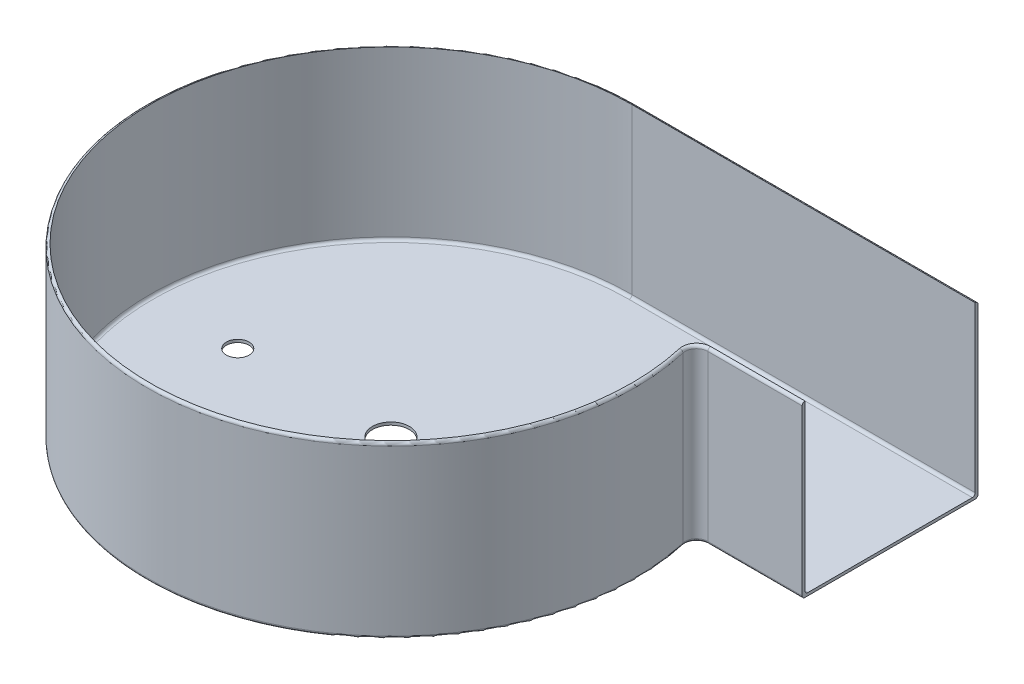
ISO-10303-21;
HEADER;
FILE_DESCRIPTION(('STEP AP214'),'2;1');
FILE_NAME('part.step','',(''),(''),'','','');
FILE_SCHEMA(('AUTOMOTIVE_DESIGN { 1 0 10303 214 1 1 1 1 }'));
ENDSEC;
DATA;
#1=APPLICATION_CONTEXT('core data for automotive mechanical design processes');
#2=APPLICATION_PROTOCOL_DEFINITION('international standard','automotive_design',2000,#1);
#3=PRODUCT_CONTEXT('',#1,'mechanical');
#4=PRODUCT('Part','Part','',(#3));
#5=PRODUCT_RELATED_PRODUCT_CATEGORY('part','',(#4));
#6=PRODUCT_DEFINITION_FORMATION('','',#4);
#7=PRODUCT_DEFINITION_CONTEXT('part definition',#1,'design');
#8=PRODUCT_DEFINITION('design','',#6,#7);
#9=PRODUCT_DEFINITION_SHAPE('','',#8);
#10=(LENGTH_UNIT() NAMED_UNIT(*) SI_UNIT(.MILLI.,.METRE.));
#11=(NAMED_UNIT(*) PLANE_ANGLE_UNIT() SI_UNIT($,.RADIAN.));
#12=(NAMED_UNIT(*) SI_UNIT($,.STERADIAN.) SOLID_ANGLE_UNIT());
#13=UNCERTAINTY_MEASURE_WITH_UNIT(LENGTH_MEASURE(1.E-05),#10,'distance_accuracy_value','');
#14=(GEOMETRIC_REPRESENTATION_CONTEXT(3) GLOBAL_UNCERTAINTY_ASSIGNED_CONTEXT((#13)) GLOBAL_UNIT_ASSIGNED_CONTEXT((#10,
#11,#12)) REPRESENTATION_CONTEXT('',''));
#15=CARTESIAN_POINT('',(0.,0.,0.));
#16=DIRECTION('',(0.,0.,1.));
#17=DIRECTION('',(1.,0.,0.));
#18=AXIS2_PLACEMENT_3D('',#15,#16,#17);
#19=CARTESIAN_POINT('',(121.,1.,0.));
#20=DIRECTION('',(-1.,0.,0.));
#21=DIRECTION('',(0.,0.,1.));
#22=AXIS2_PLACEMENT_3D('',#19,#20,#21);
#23=PLANE('',#22);
#24=DIRECTION('',(0.,0.,-1.));
#25=VECTOR('',#24,1.);
#26=CARTESIAN_POINT('',(121.,0.,0.));
#27=LINE('',#26,#25);
#28=CARTESIAN_POINT('',(121.,0.,-25.));
#29=VERTEX_POINT('',#28);
#30=CARTESIAN_POINT('',(121.,0.,-85.));
#31=VERTEX_POINT('',#30);
#32=EDGE_CURVE('E167',#29,#31,#27,.T.);
#33=ORIENTED_EDGE('',*,*,#32,.T.);
#34=CARTESIAN_POINT('',(121.,1.,-85.));
#35=DIRECTION('',(-1.,0.,0.));
#36=DIRECTION('',(0.,0.,1.));
#37=AXIS2_PLACEMENT_3D('',#34,#35,#36);
#38=CIRCLE('',#37,1.);
#39=CARTESIAN_POINT('',(121.,1.,-86.));
#40=VERTEX_POINT('',#39);
#41=EDGE_CURVE('E199',#31,#40,#38,.F.);
#42=ORIENTED_EDGE('',*,*,#41,.T.);
#43=DIRECTION('',(0.,-1.,0.));
#44=VECTOR('',#43,1.);
#45=CARTESIAN_POINT('',(121.,1.,-86.));
#46=LINE('',#45,#44);
#47=CARTESIAN_POINT('',(121.,59.,-86.));
#48=VERTEX_POINT('',#47);
#49=EDGE_CURVE('E312',#48,#40,#46,.T.);
#50=ORIENTED_EDGE('',*,*,#49,.F.);
#51=CARTESIAN_POINT('',(121.,59.,-85.));
#52=DIRECTION('',(-1.,0.,0.));
#53=DIRECTION('',(0.,0.,1.));
#54=AXIS2_PLACEMENT_3D('',#51,#52,#53);
#55=CIRCLE('',#54,1.);
#56=CARTESIAN_POINT('',(121.,60.,-85.));
#57=VERTEX_POINT('',#56);
#58=EDGE_CURVE('E184',#48,#57,#55,.F.);
#59=ORIENTED_EDGE('',*,*,#58,.T.);
#60=DIRECTION('',(0.,-1.,0.));
#61=VECTOR('',#60,1.);
#62=CARTESIAN_POINT('',(121.,60.,-85.));
#63=LINE('',#62,#61);
#64=CARTESIAN_POINT('',(121.,2.,-85.));
#65=VERTEX_POINT('',#64);
#66=EDGE_CURVE('E655',#57,#65,#63,.T.);
#67=ORIENTED_EDGE('',*,*,#66,.T.);
#68=CARTESIAN_POINT('',(121.,2.,-84.));
#69=DIRECTION('',(-1.,0.,0.));
#70=DIRECTION('',(0.,0.,1.));
#71=AXIS2_PLACEMENT_3D('',#68,#69,#70);
#72=CIRCLE('',#71,1.);
#73=CARTESIAN_POINT('',(121.,1.,-84.));
#74=VERTEX_POINT('',#73);
#75=EDGE_CURVE('E11',#65,#74,#72,.T.);
#76=ORIENTED_EDGE('',*,*,#75,.T.);
#77=DIRECTION('',(0.,0.,-1.));
#78=VECTOR('',#77,1.);
#79=CARTESIAN_POINT('',(121.,1.,0.));
#80=LINE('',#79,#78);
#81=CARTESIAN_POINT('',(121.,1.,-26.));
#82=VERTEX_POINT('',#81);
#83=EDGE_CURVE('E349',#82,#74,#80,.T.);
#84=ORIENTED_EDGE('',*,*,#83,.F.);
#85=CARTESIAN_POINT('',(121.,2.,-26.));
#86=DIRECTION('',(-1.,0.,0.));
#87=DIRECTION('',(0.,0.,1.));
#88=AXIS2_PLACEMENT_3D('',#85,#86,#87);
#89=CIRCLE('',#88,1.);
#90=CARTESIAN_POINT('',(121.,2.,-25.));
#91=VERTEX_POINT('',#90);
#92=EDGE_CURVE('E55',#82,#91,#89,.T.);
#93=ORIENTED_EDGE('',*,*,#92,.T.);
#94=DIRECTION('',(0.,-1.,0.));
#95=VECTOR('',#94,1.);
#96=CARTESIAN_POINT('',(121.,60.,-25.));
#97=LINE('',#96,#95);
#98=CARTESIAN_POINT('',(121.,60.,-25.));
#99=VERTEX_POINT('',#98);
#100=EDGE_CURVE('E154',#99,#91,#97,.T.);
#101=ORIENTED_EDGE('',*,*,#100,.F.);
#102=CARTESIAN_POINT('',(121.,59.,-25.));
#103=DIRECTION('',(-1.,0.,0.));
#104=DIRECTION('',(0.,0.,1.));
#105=AXIS2_PLACEMENT_3D('',#102,#103,#104);
#106=CIRCLE('',#105,1.);
#107=CARTESIAN_POINT('',(121.,59.,-24.));
#108=VERTEX_POINT('',#107);
#109=EDGE_CURVE('E159',#99,#108,#106,.F.);
#110=ORIENTED_EDGE('',*,*,#109,.T.);
#111=DIRECTION('',(0.,-1.,0.));
#112=VECTOR('',#111,1.);
#113=CARTESIAN_POINT('',(121.,1.,-24.));
#114=LINE('',#113,#112);
#115=CARTESIAN_POINT('',(121.,1.,-24.));
#116=VERTEX_POINT('',#115);
#117=EDGE_CURVE('E314',#108,#116,#114,.T.);
#118=ORIENTED_EDGE('',*,*,#117,.T.);
#119=CARTESIAN_POINT('',(121.,1.,-25.));
#120=DIRECTION('',(-1.,0.,0.));
#121=DIRECTION('',(0.,0.,1.));
#122=AXIS2_PLACEMENT_3D('',#119,#120,#121);
#123=CIRCLE('',#122,1.);
#124=EDGE_CURVE('E190',#116,#29,#123,.F.);
#125=ORIENTED_EDGE('',*,*,#124,.T.);
#126=EDGE_LOOP('',(#33,#42,#50,#59,#67,#76,#84,#93,#101,#110,#118,#125));
#127=FACE_BOUND('',#126,.T.);
#128=ADVANCED_FACE('F45',(#127),#23,.F.);
#129=CARTESIAN_POINT('',(0.,1.,-86.));
#130=DIRECTION('',(0.,0.,-1.));
#131=DIRECTION('',(-1.,0.,0.));
#132=AXIS2_PLACEMENT_3D('',#129,#130,#131);
#133=PLANE('',#132);
#134=ORIENTED_EDGE('',*,*,#49,.T.);
#135=DIRECTION('',(1.,0.,0.));
#136=VECTOR('',#135,1.);
#137=CARTESIAN_POINT('',(0.,1.,-86.));
#138=LINE('',#137,#136);
#139=CARTESIAN_POINT('',(0.,1.,-86.));
#140=VERTEX_POINT('',#139);
#141=EDGE_CURVE('E206',#40,#140,#138,.F.);
#142=ORIENTED_EDGE('',*,*,#141,.T.);
#143=DIRECTION('',(0.,-1.,0.));
#144=VECTOR('',#143,1.);
#145=CARTESIAN_POINT('',(0.,1.,-86.));
#146=LINE('',#145,#144);
#147=CARTESIAN_POINT('',(0.,59.,-86.));
#148=VERTEX_POINT('',#147);
#149=EDGE_CURVE('E307',#148,#140,#146,.T.);
#150=ORIENTED_EDGE('',*,*,#149,.F.);
#151=DIRECTION('',(1.,0.,0.));
#152=VECTOR('',#151,1.);
#153=CARTESIAN_POINT('',(0.,59.,-86.));
#154=LINE('',#153,#152);
#155=EDGE_CURVE('E202',#148,#48,#154,.T.);
#156=ORIENTED_EDGE('',*,*,#155,.T.);
#157=EDGE_LOOP('',(#134,#142,#150,#156));
#158=FACE_BOUND('',#157,.T.);
#159=ADVANCED_FACE('F371',(#158),#133,.T.);
#160=CARTESIAN_POINT('',(0.,1.,0.));
#161=DIRECTION('',(0.,-1.,0.));
#162=DIRECTION('',(0.,0.,-1.));
#163=AXIS2_PLACEMENT_3D('',#160,#161,#162);
#164=CYLINDRICAL_SURFACE('',#163,86.);
#165=ORIENTED_EDGE('',*,*,#149,.T.);
#166=CARTESIAN_POINT('',(0.,1.,0.));
#167=DIRECTION('',(0.,1.,0.));
#168=DIRECTION('',(0.,0.,1.));
#169=AXIS2_PLACEMENT_3D('',#166,#167,#168);
#170=CIRCLE('',#169,86.);
#171=CARTESIAN_POINT('',(83.849659701747,1.,-19.111111111111));
#172=VERTEX_POINT('',#171);
#173=EDGE_CURVE('E243',#140,#172,#170,.T.);
#174=ORIENTED_EDGE('',*,*,#173,.T.);
#175=DIRECTION('',(0.,-1.,0.));
#176=VECTOR('',#175,1.);
#177=CARTESIAN_POINT('',(83.849659701747,1.,-19.111111111111));
#178=LINE('',#177,#176);
#179=CARTESIAN_POINT('',(83.849659701747,59.,-19.111111111111));
#180=VERTEX_POINT('',#179);
#181=EDGE_CURVE('E297',#180,#172,#178,.T.);
#182=ORIENTED_EDGE('',*,*,#181,.F.);
#183=CARTESIAN_POINT('',(0.,59.,0.));
#184=DIRECTION('',(0.,1.,0.));
#185=DIRECTION('',(0.,0.,1.));
#186=AXIS2_PLACEMENT_3D('',#183,#184,#185);
#187=CIRCLE('',#186,86.);
#188=EDGE_CURVE('E240',#180,#148,#187,.F.);
#189=ORIENTED_EDGE('',*,*,#188,.T.);
#190=EDGE_LOOP('',(#165,#174,#182,#189));
#191=FACE_BOUND('',#190,.T.);
#192=ADVANCED_FACE('F303',(#191),#164,.T.);
#193=CARTESIAN_POINT('',(87.7496438739212,1.,-20.));
#194=DIRECTION('',(0.,-1.,0.));
#195=DIRECTION('',(0.,0.,-1.));
#196=AXIS2_PLACEMENT_3D('',#193,#194,#195);
#197=CYLINDRICAL_SURFACE('',#196,4.00000000000001);
#198=ORIENTED_EDGE('',*,*,#181,.T.);
#199=CARTESIAN_POINT('',(87.7496438739212,1.,-20.));
#200=DIRECTION('',(0.,1.,0.));
#201=DIRECTION('',(0.,0.,1.));
#202=AXIS2_PLACEMENT_3D('',#199,#200,#201);
#203=CIRCLE('',#202,4.00000000000001);
#204=CARTESIAN_POINT('',(87.7496438739212,1.,-24.));
#205=VERTEX_POINT('',#204);
#206=EDGE_CURVE('E217',#172,#205,#203,.F.);
#207=ORIENTED_EDGE('',*,*,#206,.T.);
#208=DIRECTION('',(0.,-1.,0.));
#209=VECTOR('',#208,1.);
#210=CARTESIAN_POINT('',(87.7496438739212,1.,-24.));
#211=LINE('',#210,#209);
#212=CARTESIAN_POINT('',(87.7496438739212,59.,-24.));
#213=VERTEX_POINT('',#212);
#214=EDGE_CURVE('E300',#213,#205,#211,.T.);
#215=ORIENTED_EDGE('',*,*,#214,.F.);
#216=CARTESIAN_POINT('',(87.7496438739212,59.,-20.));
#217=DIRECTION('',(0.,1.,0.));
#218=DIRECTION('',(0.,0.,1.));
#219=AXIS2_PLACEMENT_3D('',#216,#217,#218);
#220=CIRCLE('',#219,4.00000000000001);
#221=EDGE_CURVE('E214',#213,#180,#220,.T.);
#222=ORIENTED_EDGE('',*,*,#221,.T.);
#223=EDGE_LOOP('',(#198,#207,#215,#222));
#224=FACE_BOUND('',#223,.T.);
#225=ADVANCED_FACE('F296',(#224),#197,.F.);
#226=CARTESIAN_POINT('',(0.,1.,-24.));
#227=DIRECTION('',(0.,0.,1.));
#228=DIRECTION('',(1.,0.,0.));
#229=AXIS2_PLACEMENT_3D('',#226,#227,#228);
#230=PLANE('',#229);
#231=ORIENTED_EDGE('',*,*,#214,.T.);
#232=DIRECTION('',(-1.,0.,0.));
#233=VECTOR('',#232,1.);
#234=CARTESIAN_POINT('',(121.,1.,-24.));
#235=LINE('',#234,#233);
#236=EDGE_CURVE('E211',#205,#116,#235,.F.);
#237=ORIENTED_EDGE('',*,*,#236,.T.);
#238=ORIENTED_EDGE('',*,*,#117,.F.);
#239=DIRECTION('',(-1.,0.,0.));
#240=VECTOR('',#239,1.);
#241=CARTESIAN_POINT('',(0.,59.,-24.));
#242=LINE('',#241,#240);
#243=EDGE_CURVE('E182',#108,#213,#242,.T.);
#244=ORIENTED_EDGE('',*,*,#243,.T.);
#245=EDGE_LOOP('',(#231,#237,#238,#244));
#246=FACE_BOUND('',#245,.T.);
#247=ADVANCED_FACE('F358',(#246),#230,.T.);
#248=CARTESIAN_POINT('',(0.,1.,0.));
#249=DIRECTION('',(0.,1.,0.));
#250=DIRECTION('',(0.,0.,1.));
#251=AXIS2_PLACEMENT_3D('',#248,#249,#250);
#252=PLANE('',#251);
#253=CARTESIAN_POINT('',(-54.,1.,0.));
#254=DIRECTION('',(0.,1.,0.));
#255=DIRECTION('',(0.,0.,1.));
#256=AXIS2_PLACEMENT_3D('',#253,#254,#255);
#257=CIRCLE('',#256,4.00000000000001);
#258=CARTESIAN_POINT('',(-54.,1.,4.00000000000001));
#259=VERTEX_POINT('',#258);
#260=EDGE_CURVE('E278',#259,#259,#257,.F.);
#261=ORIENTED_EDGE('',*,*,#260,.T.);
#262=EDGE_LOOP('',(#261));
#263=FACE_BOUND('',#262,.T.);
#264=CARTESIAN_POINT('',(54.,1.,0.));
#265=DIRECTION('',(0.,1.,0.));
#266=DIRECTION('',(0.,0.,1.));
#267=AXIS2_PLACEMENT_3D('',#264,#265,#266);
#268=CIRCLE('',#267,4.00000000000001);
#269=CARTESIAN_POINT('',(54.,1.,4.00000000000001));
#270=VERTEX_POINT('',#269);
#271=EDGE_CURVE('E629',#270,#270,#268,.F.);
#272=ORIENTED_EDGE('',*,*,#271,.T.);
#273=EDGE_LOOP('',(#272));
#274=FACE_BOUND('',#273,.T.);
#275=CARTESIAN_POINT('',(0.,1.,0.));
#276=DIRECTION('',(0.,1.,0.));
#277=DIRECTION('',(0.,0.,1.));
#278=AXIS2_PLACEMENT_3D('',#275,#276,#277);
#279=CIRCLE('',#278,6.5);
#280=CARTESIAN_POINT('',(0.,1.,6.5));
#281=VERTEX_POINT('',#280);
#282=EDGE_CURVE('E263',#281,#281,#279,.T.);
#283=ORIENTED_EDGE('',*,*,#282,.F.);
#284=EDGE_LOOP('',(#283));
#285=FACE_BOUND('',#284,.T.);
#286=CARTESIAN_POINT('',(87.7496438739212,1.,-20.));
#287=DIRECTION('',(0.,1.,0.));
#288=DIRECTION('',(0.,0.,1.));
#289=AXIS2_PLACEMENT_3D('',#286,#287,#288);
#290=CIRCLE('',#289,6.00000000000001);
#291=CARTESIAN_POINT('',(81.8996676156598,1.,-18.6666666666668));
#292=VERTEX_POINT('',#291);
#293=CARTESIAN_POINT('',(87.7496438739212,1.,-26.));
#294=VERTEX_POINT('',#293);
#295=EDGE_CURVE('E229',#292,#294,#290,.F.);
#296=ORIENTED_EDGE('',*,*,#295,.T.);
#297=DIRECTION('',(-1.,0.,0.));
#298=VECTOR('',#297,1.);
#299=CARTESIAN_POINT('',(121.,1.,-26.));
#300=LINE('',#299,#298);
#301=EDGE_CURVE('E232',#294,#82,#300,.F.);
#302=ORIENTED_EDGE('',*,*,#301,.T.);
#303=ORIENTED_EDGE('',*,*,#83,.T.);
#304=DIRECTION('',(-1.,0.,0.));
#305=VECTOR('',#304,1.);
#306=CARTESIAN_POINT('',(0.,1.,-84.));
#307=LINE('',#306,#305);
#308=CARTESIAN_POINT('',(0.,1.,-84.));
#309=VERTEX_POINT('',#308);
#310=EDGE_CURVE('E226',#74,#309,#307,.T.);
#311=ORIENTED_EDGE('',*,*,#310,.T.);
#312=CARTESIAN_POINT('',(0.,1.,0.));
#313=DIRECTION('',(0.,1.,0.));
#314=DIRECTION('',(0.,0.,1.));
#315=AXIS2_PLACEMENT_3D('',#312,#313,#314);
#316=CIRCLE('',#315,84.);
#317=EDGE_CURVE('E223',#309,#292,#316,.T.);
#318=ORIENTED_EDGE('',*,*,#317,.T.);
#319=EDGE_LOOP('',(#296,#302,#303,#311,#318));
#320=FACE_BOUND('',#319,.T.);
#321=ADVANCED_FACE('F360',(#263,#274,#285,#320),#252,.T.);
#322=CARTESIAN_POINT('',(0.,0.,0.));
#323=DIRECTION('',(0.,1.,0.));
#324=DIRECTION('',(0.,0.,1.));
#325=AXIS2_PLACEMENT_3D('',#322,#323,#324);
#326=PLANE('',#325);
#327=CARTESIAN_POINT('',(-54.,0.,0.));
#328=DIRECTION('',(0.,-1.,0.));
#329=DIRECTION('',(0.,0.,-1.));
#330=AXIS2_PLACEMENT_3D('',#327,#328,#329);
#331=CIRCLE('',#330,4.00000000000001);
#332=CARTESIAN_POINT('',(-54.,0.,-4.00000000000001));
#333=VERTEX_POINT('',#332);
#334=EDGE_CURVE('E622',#333,#333,#331,.T.);
#335=ORIENTED_EDGE('',*,*,#334,.F.);
#336=EDGE_LOOP('',(#335));
#337=FACE_BOUND('',#336,.T.);
#338=CARTESIAN_POINT('',(54.,0.,0.));
#339=DIRECTION('',(0.,-1.,0.));
#340=DIRECTION('',(0.,0.,-1.));
#341=AXIS2_PLACEMENT_3D('',#338,#339,#340);
#342=CIRCLE('',#341,4.00000000000001);
#343=CARTESIAN_POINT('',(54.,0.,-4.00000000000001));
#344=VERTEX_POINT('',#343);
#345=EDGE_CURVE('E632',#344,#344,#342,.T.);
#346=ORIENTED_EDGE('',*,*,#345,.F.);
#347=EDGE_LOOP('',(#346));
#348=FACE_BOUND('',#347,.T.);
#349=CARTESIAN_POINT('',(0.,0.,0.));
#350=DIRECTION('',(0.,1.,0.));
#351=DIRECTION('',(0.,0.,1.));
#352=AXIS2_PLACEMENT_3D('',#349,#350,#351);
#353=CIRCLE('',#352,6.5);
#354=CARTESIAN_POINT('',(0.,0.,6.5));
#355=VERTEX_POINT('',#354);
#356=EDGE_CURVE('E179',#355,#355,#353,.F.);
#357=ORIENTED_EDGE('',*,*,#356,.F.);
#358=EDGE_LOOP('',(#357));
#359=FACE_BOUND('',#358,.T.);
#360=CARTESIAN_POINT('',(0.,0.,0.));
#361=DIRECTION('',(0.,1.,0.));
#362=DIRECTION('',(0.,0.,1.));
#363=AXIS2_PLACEMENT_3D('',#360,#361,#362);
#364=CIRCLE('',#363,85.);
#365=CARTESIAN_POINT('',(82.8746636587034,0.,-18.8888888888888));
#366=VERTEX_POINT('',#365);
#367=CARTESIAN_POINT('',(0.,0.,-85.));
#368=VERTEX_POINT('',#367);
#369=EDGE_CURVE('E321',#366,#368,#364,.F.);
#370=ORIENTED_EDGE('',*,*,#369,.T.);
#371=DIRECTION('',(1.,0.,0.));
#372=VECTOR('',#371,1.);
#373=CARTESIAN_POINT('',(121.,0.,-85.));
#374=LINE('',#373,#372);
#375=EDGE_CURVE('E185',#368,#31,#374,.T.);
#376=ORIENTED_EDGE('',*,*,#375,.T.);
#377=ORIENTED_EDGE('',*,*,#32,.F.);
#378=DIRECTION('',(-1.,0.,0.));
#379=VECTOR('',#378,1.);
#380=CARTESIAN_POINT('',(87.7496438739212,0.,-25.));
#381=LINE('',#380,#379);
#382=CARTESIAN_POINT('',(87.7496438739212,0.,-25.));
#383=VERTEX_POINT('',#382);
#384=EDGE_CURVE('E193',#29,#383,#381,.T.);
#385=ORIENTED_EDGE('',*,*,#384,.T.);
#386=CARTESIAN_POINT('',(87.7496438739212,0.,-20.));
#387=DIRECTION('',(0.,1.,0.));
#388=DIRECTION('',(0.,0.,1.));
#389=AXIS2_PLACEMENT_3D('',#386,#387,#388);
#390=CIRCLE('',#389,5.00000000000001);
#391=EDGE_CURVE('E324',#383,#366,#390,.T.);
#392=ORIENTED_EDGE('',*,*,#391,.T.);
#393=EDGE_LOOP('',(#370,#376,#377,#385,#392));
#394=FACE_BOUND('',#393,.T.);
#395=ADVANCED_FACE('F332',(#337,#348,#359,#394),#326,.F.);
#396=CARTESIAN_POINT('',(0.,60.,-25.));
#397=DIRECTION('',(0.,0.,-1.));
#398=DIRECTION('',(-1.,0.,0.));
#399=AXIS2_PLACEMENT_3D('',#396,#397,#398);
#400=PLANE('',#399);
#401=ORIENTED_EDGE('',*,*,#100,.T.);
#402=DIRECTION('',(-1.,0.,0.));
#403=VECTOR('',#402,1.);
#404=CARTESIAN_POINT('',(87.7496438739212,2.,-25.));
#405=LINE('',#404,#403);
#406=CARTESIAN_POINT('',(87.7496438739212,2.,-25.));
#407=VERTEX_POINT('',#406);
#408=EDGE_CURVE('E220',#91,#407,#405,.T.);
#409=ORIENTED_EDGE('',*,*,#408,.T.);
#410=DIRECTION('',(0.,-1.,0.));
#411=VECTOR('',#410,1.);
#412=CARTESIAN_POINT('',(87.7496438739212,60.,-25.));
#413=LINE('',#412,#411);
#414=CARTESIAN_POINT('',(87.7496438739212,60.,-25.));
#415=VERTEX_POINT('',#414);
#416=EDGE_CURVE('E168',#415,#407,#413,.T.);
#417=ORIENTED_EDGE('',*,*,#416,.F.);
#418=DIRECTION('',(1.,0.,0.));
#419=VECTOR('',#418,1.);
#420=CARTESIAN_POINT('',(0.,60.,-25.));
#421=LINE('',#420,#419);
#422=EDGE_CURVE('E171',#415,#99,#421,.T.);
#423=ORIENTED_EDGE('',*,*,#422,.T.);
#424=EDGE_LOOP('',(#401,#409,#417,#423));
#425=FACE_BOUND('',#424,.T.);
#426=ADVANCED_FACE('F172',(#425),#400,.T.);
#427=CARTESIAN_POINT('',(87.7496438739212,60.,-20.));
#428=DIRECTION('',(0.,-1.,0.));
#429=DIRECTION('',(0.,0.,-1.));
#430=AXIS2_PLACEMENT_3D('',#427,#428,#429);
#431=CYLINDRICAL_SURFACE('',#430,5.00000000000001);
#432=ORIENTED_EDGE('',*,*,#416,.T.);
#433=CARTESIAN_POINT('',(87.7496438739212,2.,-20.));
#434=DIRECTION('',(0.,1.,0.));
#435=DIRECTION('',(0.,0.,1.));
#436=AXIS2_PLACEMENT_3D('',#433,#434,#435);
#437=CIRCLE('',#436,5.00000000000001);
#438=CARTESIAN_POINT('',(82.8746636587034,2.,-18.888888888889));
#439=VERTEX_POINT('',#438);
#440=EDGE_CURVE('E71',#407,#439,#437,.T.);
#441=ORIENTED_EDGE('',*,*,#440,.T.);
#442=DIRECTION('',(0.,-1.,0.));
#443=VECTOR('',#442,1.);
#444=CARTESIAN_POINT('',(82.8746636587034,60.,-18.888888888889));
#445=LINE('',#444,#443);
#446=CARTESIAN_POINT('',(82.8746636587034,60.,-18.888888888889));
#447=VERTEX_POINT('',#446);
#448=EDGE_CURVE('E662',#447,#439,#445,.T.);
#449=ORIENTED_EDGE('',*,*,#448,.F.);
#450=CARTESIAN_POINT('',(87.7496438739212,60.,-20.));
#451=DIRECTION('',(0.,1.,0.));
#452=DIRECTION('',(0.,0.,1.));
#453=AXIS2_PLACEMENT_3D('',#450,#451,#452);
#454=CIRCLE('',#453,5.00000000000001);
#455=EDGE_CURVE('E178',#415,#447,#454,.T.);
#456=ORIENTED_EDGE('',*,*,#455,.F.);
#457=EDGE_LOOP('',(#432,#441,#449,#456));
#458=FACE_BOUND('',#457,.T.);
#459=ADVANCED_FACE('F475',(#458),#431,.T.);
#460=CARTESIAN_POINT('',(0.,60.,0.));
#461=DIRECTION('',(0.,-1.,0.));
#462=DIRECTION('',(0.,0.,-1.));
#463=AXIS2_PLACEMENT_3D('',#460,#461,#462);
#464=CYLINDRICAL_SURFACE('',#463,85.);
#465=ORIENTED_EDGE('',*,*,#448,.T.);
#466=CARTESIAN_POINT('',(0.,2.,0.));
#467=DIRECTION('',(0.,1.,0.));
#468=DIRECTION('',(0.,0.,1.));
#469=AXIS2_PLACEMENT_3D('',#466,#467,#468);
#470=CIRCLE('',#469,85.);
#471=CARTESIAN_POINT('',(0.,2.,-85.));
#472=VERTEX_POINT('',#471);
#473=EDGE_CURVE('E63',#439,#472,#470,.F.);
#474=ORIENTED_EDGE('',*,*,#473,.T.);
#475=DIRECTION('',(0.,-1.,0.));
#476=VECTOR('',#475,1.);
#477=CARTESIAN_POINT('',(0.,60.,-85.));
#478=LINE('',#477,#476);
#479=CARTESIAN_POINT('',(0.,60.,-85.));
#480=VERTEX_POINT('',#479);
#481=EDGE_CURVE('E659',#480,#472,#478,.T.);
#482=ORIENTED_EDGE('',*,*,#481,.F.);
#483=CARTESIAN_POINT('',(0.,60.,0.));
#484=DIRECTION('',(0.,1.,0.));
#485=DIRECTION('',(0.,0.,1.));
#486=AXIS2_PLACEMENT_3D('',#483,#484,#485);
#487=CIRCLE('',#486,85.);
#488=EDGE_CURVE('E647',#480,#447,#487,.T.);
#489=ORIENTED_EDGE('',*,*,#488,.T.);
#490=EDGE_LOOP('',(#465,#474,#482,#489));
#491=FACE_BOUND('',#490,.T.);
#492=ADVANCED_FACE('F467',(#491),#464,.F.);
#493=CARTESIAN_POINT('',(0.,60.,-85.));
#494=DIRECTION('',(0.,0.,-1.));
#495=DIRECTION('',(-1.,0.,0.));
#496=AXIS2_PLACEMENT_3D('',#493,#494,#495);
#497=PLANE('',#496);
#498=ORIENTED_EDGE('',*,*,#481,.T.);
#499=DIRECTION('',(-1.,0.,0.));
#500=VECTOR('',#499,1.);
#501=CARTESIAN_POINT('',(0.,2.,-85.));
#502=LINE('',#501,#500);
#503=EDGE_CURVE('E237',#472,#65,#502,.F.);
#504=ORIENTED_EDGE('',*,*,#503,.T.);
#505=ORIENTED_EDGE('',*,*,#66,.F.);
#506=DIRECTION('',(1.,0.,0.));
#507=VECTOR('',#506,1.);
#508=CARTESIAN_POINT('',(0.,60.,-85.));
#509=LINE('',#508,#507);
#510=EDGE_CURVE('E651',#480,#57,#509,.T.);
#511=ORIENTED_EDGE('',*,*,#510,.F.);
#512=EDGE_LOOP('',(#498,#504,#505,#511));
#513=FACE_BOUND('',#512,.T.);
#514=ADVANCED_FACE('F460',(#513),#497,.F.);
#515=CARTESIAN_POINT('',(0.,-18.3847763108502,0.));
#516=DIRECTION('',(0.,1.,0.));
#517=DIRECTION('',(0.,0.,1.));
#518=AXIS2_PLACEMENT_3D('',#515,#516,#517);
#519=CYLINDRICAL_SURFACE('',#518,6.5);
#520=ORIENTED_EDGE('',*,*,#356,.T.);
#521=EDGE_LOOP('',(#520));
#522=FACE_BOUND('',#521,.T.);
#523=ORIENTED_EDGE('',*,*,#282,.T.);
#524=EDGE_LOOP('',(#523));
#525=FACE_BOUND('',#524,.T.);
#526=ADVANCED_FACE('F390',(#522,#525),#519,.F.);
#527=CARTESIAN_POINT('',(0.,1.,-25.));
#528=DIRECTION('',(1.,0.,0.));
#529=DIRECTION('',(0.,0.,-1.));
#530=AXIS2_PLACEMENT_3D('',#527,#528,#529);
#531=CYLINDRICAL_SURFACE('',#530,1.);
#532=ORIENTED_EDGE('',*,*,#124,.F.);
#533=ORIENTED_EDGE('',*,*,#236,.F.);
#534=CARTESIAN_POINT('',(87.7496438739212,1.,-25.));
#535=DIRECTION('',(-1.,0.,0.));
#536=DIRECTION('',(0.,0.,1.));
#537=AXIS2_PLACEMENT_3D('',#534,#535,#536);
#538=CIRCLE('',#537,1.);
#539=EDGE_CURVE('E259',#383,#205,#538,.T.);
#540=ORIENTED_EDGE('',*,*,#539,.F.);
#541=ORIENTED_EDGE('',*,*,#384,.F.);
#542=EDGE_LOOP('',(#532,#533,#540,#541));
#543=FACE_BOUND('',#542,.T.);
#544=ADVANCED_FACE('F338',(#543),#531,.T.);
#545=CARTESIAN_POINT('',(87.7496438739212,1.,-20.));
#546=DIRECTION('',(0.,1.,0.));
#547=DIRECTION('',(0.,0.,1.));
#548=AXIS2_PLACEMENT_3D('',#545,#546,#547);
#549=TOROIDAL_SURFACE('',#548,5.00000000000001,1.);
#550=ORIENTED_EDGE('',*,*,#539,.T.);
#551=ORIENTED_EDGE('',*,*,#206,.F.);
#552=CARTESIAN_POINT('',(82.8746636587034,1.,-18.8888888888888));
#553=DIRECTION('',(0.222222222222243,0.,0.974996043043564));
#554=DIRECTION('',(0.974996043043564,0.,-0.222222222222243));
#555=AXIS2_PLACEMENT_3D('',#552,#553,#554);
#556=CIRCLE('',#555,1.);
#557=EDGE_CURVE('E254',#366,#172,#556,.T.);
#558=ORIENTED_EDGE('',*,*,#557,.F.);
#559=ORIENTED_EDGE('',*,*,#391,.F.);
#560=EDGE_LOOP('',(#550,#551,#558,#559));
#561=FACE_BOUND('',#560,.T.);
#562=ADVANCED_FACE('F340',(#561),#549,.T.);
#563=CARTESIAN_POINT('',(0.,1.,0.));
#564=DIRECTION('',(0.,1.,0.));
#565=DIRECTION('',(0.,0.,1.));
#566=AXIS2_PLACEMENT_3D('',#563,#564,#565);
#567=TOROIDAL_SURFACE('',#566,85.,1.);
#568=ORIENTED_EDGE('',*,*,#557,.T.);
#569=ORIENTED_EDGE('',*,*,#173,.F.);
#570=CARTESIAN_POINT('',(0.,1.,-85.));
#571=DIRECTION('',(1.,0.,0.));
#572=DIRECTION('',(0.,0.,-1.));
#573=AXIS2_PLACEMENT_3D('',#570,#571,#572);
#574=CIRCLE('',#573,1.);
#575=EDGE_CURVE('E250',#368,#140,#574,.T.);
#576=ORIENTED_EDGE('',*,*,#575,.F.);
#577=ORIENTED_EDGE('',*,*,#369,.F.);
#578=EDGE_LOOP('',(#568,#569,#576,#577));
#579=FACE_BOUND('',#578,.T.);
#580=ADVANCED_FACE('F344',(#579),#567,.T.);
#581=CARTESIAN_POINT('',(0.,1.,-85.));
#582=DIRECTION('',(-1.,0.,0.));
#583=DIRECTION('',(0.,0.,1.));
#584=AXIS2_PLACEMENT_3D('',#581,#582,#583);
#585=CYLINDRICAL_SURFACE('',#584,1.);
#586=ORIENTED_EDGE('',*,*,#575,.T.);
#587=ORIENTED_EDGE('',*,*,#141,.F.);
#588=ORIENTED_EDGE('',*,*,#41,.F.);
#589=ORIENTED_EDGE('',*,*,#375,.F.);
#590=EDGE_LOOP('',(#586,#587,#588,#589));
#591=FACE_BOUND('',#590,.T.);
#592=ADVANCED_FACE('F380',(#591),#585,.T.);
#593=CARTESIAN_POINT('',(0.,2.,-84.));
#594=DIRECTION('',(-1.,0.,0.));
#595=DIRECTION('',(0.,0.,1.));
#596=AXIS2_PLACEMENT_3D('',#593,#594,#595);
#597=CYLINDRICAL_SURFACE('',#596,1.);
#598=ORIENTED_EDGE('',*,*,#75,.F.);
#599=ORIENTED_EDGE('',*,*,#503,.F.);
#600=CARTESIAN_POINT('',(0.,2.,-84.));
#601=DIRECTION('',(1.,0.,0.));
#602=DIRECTION('',(0.,0.,-1.));
#603=AXIS2_PLACEMENT_3D('',#600,#601,#602);
#604=CIRCLE('',#603,1.);
#605=EDGE_CURVE('E255',#309,#472,#604,.T.);
#606=ORIENTED_EDGE('',*,*,#605,.F.);
#607=ORIENTED_EDGE('',*,*,#310,.F.);
#608=EDGE_LOOP('',(#598,#599,#606,#607));
#609=FACE_BOUND('',#608,.T.);
#610=ADVANCED_FACE('F383',(#609),#597,.F.);
#611=CARTESIAN_POINT('',(0.,2.,0.));
#612=DIRECTION('',(0.,1.,0.));
#613=DIRECTION('',(0.,0.,1.));
#614=AXIS2_PLACEMENT_3D('',#611,#612,#613);
#615=TOROIDAL_SURFACE('',#614,84.,1.);
#616=ORIENTED_EDGE('',*,*,#605,.T.);
#617=ORIENTED_EDGE('',*,*,#473,.F.);
#618=CARTESIAN_POINT('',(81.8996676156598,2.,-18.6666666666668));
#619=DIRECTION('',(0.222222222222207,0.,0.974996043043573));
#620=DIRECTION('',(0.974996043043573,0.,-0.222222222222207));
#621=AXIS2_PLACEMENT_3D('',#618,#619,#620);
#622=CIRCLE('',#621,1.);
#623=EDGE_CURVE('E267',#292,#439,#622,.T.);
#624=ORIENTED_EDGE('',*,*,#623,.F.);
#625=ORIENTED_EDGE('',*,*,#317,.F.);
#626=EDGE_LOOP('',(#616,#617,#624,#625));
#627=FACE_BOUND('',#626,.T.);
#628=ADVANCED_FACE('F398',(#627),#615,.F.);
#629=CARTESIAN_POINT('',(87.7496438739212,2.,-20.));
#630=DIRECTION('',(0.,1.,0.));
#631=DIRECTION('',(0.,0.,1.));
#632=AXIS2_PLACEMENT_3D('',#629,#630,#631);
#633=TOROIDAL_SURFACE('',#632,6.00000000000001,1.);
#634=ORIENTED_EDGE('',*,*,#623,.T.);
#635=ORIENTED_EDGE('',*,*,#440,.F.);
#636=CARTESIAN_POINT('',(87.7496438739212,2.,-26.));
#637=DIRECTION('',(-1.,0.,0.));
#638=DIRECTION('',(0.,0.,1.));
#639=AXIS2_PLACEMENT_3D('',#636,#637,#638);
#640=CIRCLE('',#639,1.);
#641=EDGE_CURVE('E264',#294,#407,#640,.T.);
#642=ORIENTED_EDGE('',*,*,#641,.F.);
#643=ORIENTED_EDGE('',*,*,#295,.F.);
#644=EDGE_LOOP('',(#634,#635,#642,#643));
#645=FACE_BOUND('',#644,.T.);
#646=ADVANCED_FACE('F394',(#645),#633,.F.);
#647=CARTESIAN_POINT('',(0.,2.,-26.));
#648=DIRECTION('',(1.,0.,0.));
#649=DIRECTION('',(0.,0.,-1.));
#650=AXIS2_PLACEMENT_3D('',#647,#648,#649);
#651=CYLINDRICAL_SURFACE('',#650,1.);
#652=ORIENTED_EDGE('',*,*,#92,.F.);
#653=ORIENTED_EDGE('',*,*,#301,.F.);
#654=ORIENTED_EDGE('',*,*,#641,.T.);
#655=ORIENTED_EDGE('',*,*,#408,.F.);
#656=EDGE_LOOP('',(#652,#653,#654,#655));
#657=FACE_BOUND('',#656,.T.);
#658=ADVANCED_FACE('F391',(#657),#651,.F.);
#659=CARTESIAN_POINT('',(0.,59.,-25.));
#660=DIRECTION('',(-1.,0.,0.));
#661=DIRECTION('',(0.,0.,1.));
#662=AXIS2_PLACEMENT_3D('',#659,#660,#661);
#663=CYLINDRICAL_SURFACE('',#662,1.);
#664=ORIENTED_EDGE('',*,*,#109,.F.);
#665=ORIENTED_EDGE('',*,*,#422,.F.);
#666=CARTESIAN_POINT('',(87.7496438739212,59.,-25.));
#667=DIRECTION('',(-1.,0.,0.));
#668=DIRECTION('',(0.,0.,1.));
#669=AXIS2_PLACEMENT_3D('',#666,#667,#668);
#670=CIRCLE('',#669,1.);
#671=EDGE_CURVE('E49',#213,#415,#670,.T.);
#672=ORIENTED_EDGE('',*,*,#671,.F.);
#673=ORIENTED_EDGE('',*,*,#243,.F.);
#674=EDGE_LOOP('',(#664,#665,#672,#673));
#675=FACE_BOUND('',#674,.T.);
#676=ADVANCED_FACE('F47',(#675),#663,.T.);
#677=CARTESIAN_POINT('',(87.7496438739212,59.,-20.));
#678=DIRECTION('',(0.,1.,0.));
#679=DIRECTION('',(0.,0.,1.));
#680=AXIS2_PLACEMENT_3D('',#677,#678,#679);
#681=TOROIDAL_SURFACE('',#680,5.00000000000001,1.);
#682=ORIENTED_EDGE('',*,*,#671,.T.);
#683=ORIENTED_EDGE('',*,*,#455,.T.);
#684=CARTESIAN_POINT('',(82.8746636587034,59.,-18.8888888888888));
#685=DIRECTION('',(0.222222222222243,0.,0.974996043043565));
#686=DIRECTION('',(0.974996043043565,0.,-0.222222222222243));
#687=AXIS2_PLACEMENT_3D('',#684,#685,#686);
#688=CIRCLE('',#687,1.);
#689=EDGE_CURVE('E277',#180,#447,#688,.T.);
#690=ORIENTED_EDGE('',*,*,#689,.F.);
#691=ORIENTED_EDGE('',*,*,#221,.F.);
#692=EDGE_LOOP('',(#682,#683,#690,#691));
#693=FACE_BOUND('',#692,.T.);
#694=ADVANCED_FACE('F291',(#693),#681,.T.);
#695=CARTESIAN_POINT('',(0.,59.,0.));
#696=DIRECTION('',(0.,1.,0.));
#697=DIRECTION('',(0.,0.,1.));
#698=AXIS2_PLACEMENT_3D('',#695,#696,#697);
#699=TOROIDAL_SURFACE('',#698,85.,1.);
#700=ORIENTED_EDGE('',*,*,#689,.T.);
#701=ORIENTED_EDGE('',*,*,#488,.F.);
#702=CARTESIAN_POINT('',(0.,59.,-85.));
#703=DIRECTION('',(1.,0.,0.));
#704=DIRECTION('',(0.,0.,-1.));
#705=AXIS2_PLACEMENT_3D('',#702,#703,#704);
#706=CIRCLE('',#705,1.);
#707=EDGE_CURVE('E274',#148,#480,#706,.T.);
#708=ORIENTED_EDGE('',*,*,#707,.F.);
#709=ORIENTED_EDGE('',*,*,#188,.F.);
#710=EDGE_LOOP('',(#700,#701,#708,#709));
#711=FACE_BOUND('',#710,.T.);
#712=ADVANCED_FACE('F410',(#711),#699,.T.);
#713=CARTESIAN_POINT('',(0.,59.,-85.));
#714=DIRECTION('',(1.,0.,0.));
#715=DIRECTION('',(0.,0.,-1.));
#716=AXIS2_PLACEMENT_3D('',#713,#714,#715);
#717=CYLINDRICAL_SURFACE('',#716,1.);
#718=ORIENTED_EDGE('',*,*,#707,.T.);
#719=ORIENTED_EDGE('',*,*,#510,.T.);
#720=ORIENTED_EDGE('',*,*,#58,.F.);
#721=ORIENTED_EDGE('',*,*,#155,.F.);
#722=EDGE_LOOP('',(#718,#719,#720,#721));
#723=FACE_BOUND('',#722,.T.);
#724=ADVANCED_FACE('F406',(#723),#717,.T.);
#725=CARTESIAN_POINT('',(54.,12.3137084989848,0.));
#726=DIRECTION('',(0.,-1.,0.));
#727=DIRECTION('',(0.,0.,-1.));
#728=AXIS2_PLACEMENT_3D('',#725,#726,#727);
#729=CYLINDRICAL_SURFACE('',#728,4.00000000000001);
#730=ORIENTED_EDGE('',*,*,#345,.T.);
#731=EDGE_LOOP('',(#730));
#732=FACE_BOUND('',#731,.T.);
#733=ORIENTED_EDGE('',*,*,#271,.F.);
#734=EDGE_LOOP('',(#733));
#735=FACE_BOUND('',#734,.T.);
#736=ADVANCED_FACE('F409',(#732,#735),#729,.F.);
#737=CARTESIAN_POINT('',(-54.,12.3137084989848,0.));
#738=DIRECTION('',(0.,-1.,0.));
#739=DIRECTION('',(0.,0.,-1.));
#740=AXIS2_PLACEMENT_3D('',#737,#738,#739);
#741=CYLINDRICAL_SURFACE('',#740,4.00000000000001);
#742=ORIENTED_EDGE('',*,*,#334,.T.);
#743=EDGE_LOOP('',(#742));
#744=FACE_BOUND('',#743,.T.);
#745=ORIENTED_EDGE('',*,*,#260,.F.);
#746=EDGE_LOOP('',(#745));
#747=FACE_BOUND('',#746,.T.);
#748=ADVANCED_FACE('F598',(#744,#747),#741,.F.);
#749=CLOSED_SHELL('',(#128,#159,#192,#225,#247,#321,#395,#426,#459,#492,#514,#526,#544,#562,
#580,#592,#610,#628,#646,#658,#676,#694,#712,#724,#736,#748));
#750=MANIFOLD_SOLID_BREP('B2',#749);
#751=ADVANCED_BREP_SHAPE_REPRESENTATION('',(#18,#750),#14);
#752=SHAPE_DEFINITION_REPRESENTATION(#9,#751);
ENDSEC;
END-ISO-10303-21;
